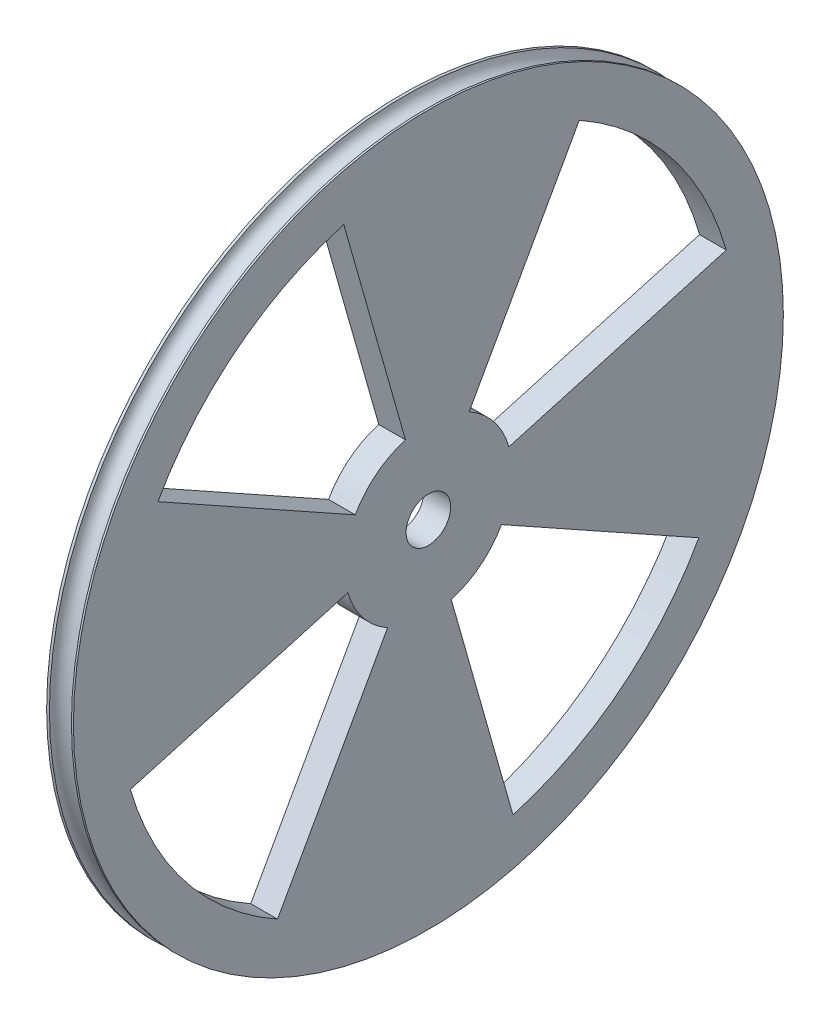
ISO-10303-21;
HEADER;
FILE_DESCRIPTION(('STEP AP214'),'2;1');
FILE_NAME('part.step','',(''),(''),'','','');
FILE_SCHEMA(('AUTOMOTIVE_DESIGN { 1 0 10303 214 1 1 1 1 }'));
ENDSEC;
DATA;
#1=APPLICATION_CONTEXT('core data for automotive mechanical design processes');
#2=APPLICATION_PROTOCOL_DEFINITION('international standard','automotive_design',2000,#1);
#3=PRODUCT_CONTEXT('',#1,'mechanical');
#4=PRODUCT('Part','Part','',(#3));
#5=PRODUCT_RELATED_PRODUCT_CATEGORY('part','',(#4));
#6=PRODUCT_DEFINITION_FORMATION('','',#4);
#7=PRODUCT_DEFINITION_CONTEXT('part definition',#1,'design');
#8=PRODUCT_DEFINITION('design','',#6,#7);
#9=PRODUCT_DEFINITION_SHAPE('','',#8);
#10=(LENGTH_UNIT() NAMED_UNIT(*) SI_UNIT(.MILLI.,.METRE.));
#11=(NAMED_UNIT(*) PLANE_ANGLE_UNIT() SI_UNIT($,.RADIAN.));
#12=(NAMED_UNIT(*) SI_UNIT($,.STERADIAN.) SOLID_ANGLE_UNIT());
#13=UNCERTAINTY_MEASURE_WITH_UNIT(LENGTH_MEASURE(1.E-05),#10,'distance_accuracy_value','');
#14=(GEOMETRIC_REPRESENTATION_CONTEXT(3) GLOBAL_UNCERTAINTY_ASSIGNED_CONTEXT((#13)) GLOBAL_UNIT_ASSIGNED_CONTEXT((#10,
#11,#12)) REPRESENTATION_CONTEXT('',''));
#15=CARTESIAN_POINT('',(0.,0.,0.));
#16=DIRECTION('',(0.,0.,1.));
#17=DIRECTION('',(1.,0.,0.));
#18=AXIS2_PLACEMENT_3D('',#15,#16,#17);
#19=CARTESIAN_POINT('',(0.,50.546,0.));
#20=DIRECTION('',(1.,0.,0.));
#21=DIRECTION('',(0.,0.,-1.));
#22=AXIS2_PLACEMENT_3D('',#19,#20,#21);
#23=PLANE('',#22);
#24=CARTESIAN_POINT('',(0.,0.,0.));
#25=DIRECTION('',(1.,0.,0.));
#26=DIRECTION('',(0.,0.,-1.));
#27=AXIS2_PLACEMENT_3D('',#24,#25,#26);
#28=CIRCLE('',#27,3.175);
#29=CARTESIAN_POINT('',(0.,0.,-3.175));
#30=VERTEX_POINT('',#29);
#31=EDGE_CURVE('E295',#30,#30,#28,.T.);
#32=ORIENTED_EDGE('',*,*,#31,.T.);
#33=EDGE_LOOP('',(#32));
#34=FACE_BOUND('',#33,.T.);
#35=CARTESIAN_POINT('',(0.,0.,0.));
#36=DIRECTION('',(1.,0.,0.));
#37=DIRECTION('',(0.,0.,-1.));
#38=AXIS2_PLACEMENT_3D('',#35,#36,#37);
#39=CIRCLE('',#38,11.9232198909498);
#40=CARTESIAN_POINT('',(0.,-3.2563701045731,11.4699270403078));
#41=VERTEX_POINT('',#40);
#42=CARTESIAN_POINT('',(0.,-10.4130645729134,5.80786180691978));
#43=VERTEX_POINT('',#42);
#44=EDGE_CURVE('E256',#41,#43,#39,.T.);
#45=ORIENTED_EDGE('',*,*,#44,.F.);
#46=DIRECTION('',(0.,-0.273111637154726,0.961982345810288));
#47=VECTOR('',#46,1.);
#48=CARTESIAN_POINT('',(0.,0.,0.));
#49=LINE('',#48,#47);
#50=CARTESIAN_POINT('',(0.,-12.0433290603831,42.4202720234474));
#51=VERTEX_POINT('',#50);
#52=EDGE_CURVE('E271',#41,#51,#49,.T.);
#53=ORIENTED_EDGE('',*,*,#52,.T.);
#54=CARTESIAN_POINT('',(0.,0.,0.));
#55=DIRECTION('',(1.,0.,0.));
#56=DIRECTION('',(0.,0.,-1.));
#57=AXIS2_PLACEMENT_3D('',#54,#55,#56);
#58=CIRCLE('',#57,44.0967261075007);
#59=CARTESIAN_POINT('',(0.,-38.5115816542155,21.4797423608996));
#60=VERTEX_POINT('',#59);
#61=EDGE_CURVE('E285',#51,#60,#58,.T.);
#62=ORIENTED_EDGE('',*,*,#61,.T.);
#63=DIRECTION('',(0.,-0.873343330757265,0.487105149451129));
#64=VECTOR('',#63,1.);
#65=CARTESIAN_POINT('',(0.,0.,0.));
#66=LINE('',#65,#64);
#67=EDGE_CURVE('E282',#43,#60,#66,.T.);
#68=ORIENTED_EDGE('',*,*,#67,.F.);
#69=EDGE_LOOP('',(#45,#53,#62,#68));
#70=FACE_BOUND('',#69,.T.);
#71=CARTESIAN_POINT('',(0.,0.,0.));
#72=DIRECTION('',(1.,0.,0.));
#73=DIRECTION('',(0.,0.,-1.));
#74=AXIS2_PLACEMENT_3D('',#71,#72,#73);
#75=CIRCLE('',#74,11.9232198909498);
#76=CARTESIAN_POINT('',(0.,-11.4699270403078,-3.25637010457314));
#77=VERTEX_POINT('',#76);
#78=CARTESIAN_POINT('',(0.,-5.80786180691974,-10.4130645729134));
#79=VERTEX_POINT('',#78);
#80=EDGE_CURVE('E216',#77,#79,#75,.T.);
#81=ORIENTED_EDGE('',*,*,#80,.F.);
#82=DIRECTION('',(0.,-0.961982345810287,-0.27311163715473));
#83=VECTOR('',#82,1.);
#84=CARTESIAN_POINT('',(0.,0.,0.));
#85=LINE('',#84,#83);
#86=CARTESIAN_POINT('',(0.,-42.4202720234473,-12.0433290603832));
#87=VERTEX_POINT('',#86);
#88=EDGE_CURVE('E231',#77,#87,#85,.T.);
#89=ORIENTED_EDGE('',*,*,#88,.T.);
#90=CARTESIAN_POINT('',(0.,0.,0.));
#91=DIRECTION('',(1.,0.,0.));
#92=DIRECTION('',(0.,0.,-1.));
#93=AXIS2_PLACEMENT_3D('',#90,#91,#92);
#94=CIRCLE('',#93,44.0967261075007);
#95=CARTESIAN_POINT('',(0.,-21.4797423608995,-38.5115816542156));
#96=VERTEX_POINT('',#95);
#97=EDGE_CURVE('E245',#87,#96,#94,.T.);
#98=ORIENTED_EDGE('',*,*,#97,.T.);
#99=DIRECTION('',(0.,-0.487105149451126,-0.873343330757267));
#100=VECTOR('',#99,1.);
#101=CARTESIAN_POINT('',(0.,0.,0.));
#102=LINE('',#101,#100);
#103=EDGE_CURVE('E242',#79,#96,#102,.T.);
#104=ORIENTED_EDGE('',*,*,#103,.F.);
#105=EDGE_LOOP('',(#81,#89,#98,#104));
#106=FACE_BOUND('',#105,.T.);
#107=CARTESIAN_POINT('',(0.,0.,0.));
#108=DIRECTION('',(1.,0.,0.));
#109=DIRECTION('',(0.,0.,-1.));
#110=AXIS2_PLACEMENT_3D('',#107,#108,#109);
#111=CIRCLE('',#110,11.9232198909498);
#112=CARTESIAN_POINT('',(0.,3.25637010457318,-11.4699270403078));
#113=VERTEX_POINT('',#112);
#114=CARTESIAN_POINT('',(0.,10.4130645729134,-5.80786180691971));
#115=VERTEX_POINT('',#114);
#116=EDGE_CURVE('E198',#113,#115,#111,.T.);
#117=ORIENTED_EDGE('',*,*,#116,.F.);
#118=DIRECTION('',(0.,0.273111637154733,-0.961982345810286));
#119=VECTOR('',#118,1.);
#120=CARTESIAN_POINT('',(0.,0.,0.));
#121=LINE('',#120,#119);
#122=CARTESIAN_POINT('',(0.,12.0433290603834,-42.4202720234473));
#123=VERTEX_POINT('',#122);
#124=EDGE_CURVE('E166',#113,#123,#121,.T.);
#125=ORIENTED_EDGE('',*,*,#124,.T.);
#126=CARTESIAN_POINT('',(0.,0.,0.));
#127=DIRECTION('',(1.,0.,0.));
#128=DIRECTION('',(0.,0.,-1.));
#129=AXIS2_PLACEMENT_3D('',#126,#127,#128);
#130=CIRCLE('',#129,44.0967261075007);
#131=CARTESIAN_POINT('',(0.,38.5115816542157,-21.4797423608994));
#132=VERTEX_POINT('',#131);
#133=EDGE_CURVE('E206',#123,#132,#130,.T.);
#134=ORIENTED_EDGE('',*,*,#133,.T.);
#135=DIRECTION('',(0.,0.873343330757268,-0.487105149451123));
#136=VECTOR('',#135,1.);
#137=CARTESIAN_POINT('',(0.,0.,0.));
#138=LINE('',#137,#136);
#139=EDGE_CURVE('E201',#115,#132,#138,.T.);
#140=ORIENTED_EDGE('',*,*,#139,.F.);
#141=EDGE_LOOP('',(#117,#125,#134,#140));
#142=FACE_BOUND('',#141,.T.);
#143=CARTESIAN_POINT('',(0.,0.,0.));
#144=DIRECTION('',(1.,0.,0.));
#145=DIRECTION('',(0.,0.,-1.));
#146=AXIS2_PLACEMENT_3D('',#143,#144,#145);
#147=CIRCLE('',#146,11.9232198909498);
#148=CARTESIAN_POINT('',(0.,11.4699270403078,3.25637010457322));
#149=VERTEX_POINT('',#148);
#150=CARTESIAN_POINT('',(0.,5.80786180691967,10.4130645729134));
#151=VERTEX_POINT('',#150);
#152=EDGE_CURVE('E312',#149,#151,#147,.T.);
#153=ORIENTED_EDGE('',*,*,#152,.F.);
#154=DIRECTION('',(0.,0.961982345810286,0.273111637154736));
#155=VECTOR('',#154,1.);
#156=CARTESIAN_POINT('',(0.,0.,0.));
#157=LINE('',#156,#155);
#158=CARTESIAN_POINT('',(0.,42.4202720234472,12.0433290603835));
#159=VERTEX_POINT('',#158);
#160=EDGE_CURVE('E299',#149,#159,#157,.T.);
#161=ORIENTED_EDGE('',*,*,#160,.T.);
#162=CARTESIAN_POINT('',(0.,0.,0.));
#163=DIRECTION('',(1.,0.,0.));
#164=DIRECTION('',(0.,0.,-1.));
#165=AXIS2_PLACEMENT_3D('',#162,#163,#164);
#166=CIRCLE('',#165,44.0967261075007);
#167=CARTESIAN_POINT('',(0.,21.4797423608993,38.5115816542158));
#168=VERTEX_POINT('',#167);
#169=EDGE_CURVE('E303',#159,#168,#166,.T.);
#170=ORIENTED_EDGE('',*,*,#169,.T.);
#171=DIRECTION('',(0.,0.48710514945112,0.87334333075727));
#172=VECTOR('',#171,1.);
#173=CARTESIAN_POINT('',(0.,0.,0.));
#174=LINE('',#173,#172);
#175=EDGE_CURVE('E308',#151,#168,#174,.T.);
#176=ORIENTED_EDGE('',*,*,#175,.F.);
#177=EDGE_LOOP('',(#153,#161,#170,#176));
#178=FACE_BOUND('',#177,.T.);
#179=CARTESIAN_POINT('',(0.,0.,0.));
#180=DIRECTION('',(-1.,0.,0.));
#181=DIRECTION('',(0.,0.,1.));
#182=AXIS2_PLACEMENT_3D('',#179,#180,#181);
#183=CIRCLE('',#182,50.546);
#184=CARTESIAN_POINT('',(0.,0.,50.546));
#185=VERTEX_POINT('',#184);
#186=EDGE_CURVE('E329',#185,#185,#183,.T.);
#187=ORIENTED_EDGE('',*,*,#186,.T.);
#188=EDGE_LOOP('',(#187));
#189=FACE_BOUND('',#188,.T.);
#190=ADVANCED_FACE('F45',(#34,#70,#106,#142,#178,#189),#23,.F.);
#191=CARTESIAN_POINT('',(3.81000000000001,0.,0.));
#192=DIRECTION('',(-1.,0.,0.));
#193=DIRECTION('',(0.,0.,1.));
#194=AXIS2_PLACEMENT_3D('',#191,#192,#193);
#195=PLANE('',#194);
#196=CARTESIAN_POINT('',(3.81000000000001,0.,0.));
#197=DIRECTION('',(1.,0.,0.));
#198=DIRECTION('',(0.,0.,-1.));
#199=AXIS2_PLACEMENT_3D('',#196,#197,#198);
#200=CIRCLE('',#199,3.175);
#201=CARTESIAN_POINT('',(3.81000000000001,0.,-3.175));
#202=VERTEX_POINT('',#201);
#203=EDGE_CURVE('E265',#202,#202,#200,.T.);
#204=ORIENTED_EDGE('',*,*,#203,.F.);
#205=EDGE_LOOP('',(#204));
#206=FACE_BOUND('',#205,.T.);
#207=CARTESIAN_POINT('',(3.81000000000001,0.,0.));
#208=DIRECTION('',(1.,0.,0.));
#209=DIRECTION('',(0.,0.,-1.));
#210=AXIS2_PLACEMENT_3D('',#207,#208,#209);
#211=CIRCLE('',#210,44.0967261075007);
#212=CARTESIAN_POINT('',(3.81000000000001,-12.0433290603831,42.4202720234474));
#213=VERTEX_POINT('',#212);
#214=CARTESIAN_POINT('',(3.81000000000001,-38.5115816542155,21.4797423608996));
#215=VERTEX_POINT('',#214);
#216=EDGE_CURVE('E275',#213,#215,#211,.T.);
#217=ORIENTED_EDGE('',*,*,#216,.F.);
#218=DIRECTION('',(0.,-0.273111637154726,0.961982345810288));
#219=VECTOR('',#218,1.);
#220=CARTESIAN_POINT('',(3.81000000000001,0.,0.));
#221=LINE('',#220,#219);
#222=CARTESIAN_POINT('',(3.81000000000001,-3.2563701045731,11.4699270403078));
#223=VERTEX_POINT('',#222);
#224=EDGE_CURVE('E225',#223,#213,#221,.T.);
#225=ORIENTED_EDGE('',*,*,#224,.F.);
#226=CARTESIAN_POINT('',(3.81000000000001,0.,0.));
#227=DIRECTION('',(1.,0.,0.));
#228=DIRECTION('',(0.,0.,-1.));
#229=AXIS2_PLACEMENT_3D('',#226,#227,#228);
#230=CIRCLE('',#229,11.9232198909498);
#231=CARTESIAN_POINT('',(3.81000000000001,-10.4130645729134,5.80786180691978));
#232=VERTEX_POINT('',#231);
#233=EDGE_CURVE('E266',#223,#232,#230,.T.);
#234=ORIENTED_EDGE('',*,*,#233,.T.);
#235=DIRECTION('',(0.,-0.873343330757265,0.487105149451129));
#236=VECTOR('',#235,1.);
#237=CARTESIAN_POINT('',(3.81000000000001,0.,0.));
#238=LINE('',#237,#236);
#239=EDGE_CURVE('E270',#232,#215,#238,.T.);
#240=ORIENTED_EDGE('',*,*,#239,.T.);
#241=EDGE_LOOP('',(#217,#225,#234,#240));
#242=FACE_BOUND('',#241,.T.);
#243=CARTESIAN_POINT('',(3.81000000000001,0.,0.));
#244=DIRECTION('',(1.,0.,0.));
#245=DIRECTION('',(0.,0.,-1.));
#246=AXIS2_PLACEMENT_3D('',#243,#244,#245);
#247=CIRCLE('',#246,44.0967261075007);
#248=CARTESIAN_POINT('',(3.81000000000001,-42.4202720234473,-12.0433290603832));
#249=VERTEX_POINT('',#248);
#250=CARTESIAN_POINT('',(3.81000000000001,-21.4797423608995,-38.5115816542156));
#251=VERTEX_POINT('',#250);
#252=EDGE_CURVE('E235',#249,#251,#247,.T.);
#253=ORIENTED_EDGE('',*,*,#252,.F.);
#254=DIRECTION('',(0.,-0.961982345810287,-0.27311163715473));
#255=VECTOR('',#254,1.);
#256=CARTESIAN_POINT('',(3.81000000000001,0.,0.));
#257=LINE('',#256,#255);
#258=CARTESIAN_POINT('',(3.81000000000001,-11.4699270403078,-3.25637010457314));
#259=VERTEX_POINT('',#258);
#260=EDGE_CURVE('E171',#259,#249,#257,.T.);
#261=ORIENTED_EDGE('',*,*,#260,.F.);
#262=CARTESIAN_POINT('',(3.81000000000001,0.,0.));
#263=DIRECTION('',(1.,0.,0.));
#264=DIRECTION('',(0.,0.,-1.));
#265=AXIS2_PLACEMENT_3D('',#262,#263,#264);
#266=CIRCLE('',#265,11.9232198909498);
#267=CARTESIAN_POINT('',(3.81000000000001,-5.80786180691974,-10.4130645729134));
#268=VERTEX_POINT('',#267);
#269=EDGE_CURVE('E226',#259,#268,#266,.T.);
#270=ORIENTED_EDGE('',*,*,#269,.T.);
#271=DIRECTION('',(0.,-0.487105149451126,-0.873343330757267));
#272=VECTOR('',#271,1.);
#273=CARTESIAN_POINT('',(3.81000000000001,0.,0.));
#274=LINE('',#273,#272);
#275=EDGE_CURVE('E230',#268,#251,#274,.T.);
#276=ORIENTED_EDGE('',*,*,#275,.T.);
#277=EDGE_LOOP('',(#253,#261,#270,#276));
#278=FACE_BOUND('',#277,.T.);
#279=CARTESIAN_POINT('',(3.81000000000001,0.,0.));
#280=DIRECTION('',(1.,0.,0.));
#281=DIRECTION('',(0.,0.,-1.));
#282=AXIS2_PLACEMENT_3D('',#279,#280,#281);
#283=CIRCLE('',#282,44.0967261075007);
#284=CARTESIAN_POINT('',(3.81000000000001,12.0433290603834,-42.4202720234473));
#285=VERTEX_POINT('',#284);
#286=CARTESIAN_POINT('',(3.81000000000001,38.5115816542157,-21.4797423608994));
#287=VERTEX_POINT('',#286);
#288=EDGE_CURVE('E187',#285,#287,#283,.T.);
#289=ORIENTED_EDGE('',*,*,#288,.F.);
#290=DIRECTION('',(0.,0.273111637154733,-0.961982345810286));
#291=VECTOR('',#290,1.);
#292=CARTESIAN_POINT('',(3.81000000000001,0.,0.));
#293=LINE('',#292,#291);
#294=CARTESIAN_POINT('',(3.81000000000001,3.25637010457318,-11.4699270403078));
#295=VERTEX_POINT('',#294);
#296=EDGE_CURVE('E163',#295,#285,#293,.T.);
#297=ORIENTED_EDGE('',*,*,#296,.F.);
#298=CARTESIAN_POINT('',(3.81000000000001,0.,0.));
#299=DIRECTION('',(1.,0.,0.));
#300=DIRECTION('',(0.,0.,-1.));
#301=AXIS2_PLACEMENT_3D('',#298,#299,#300);
#302=CIRCLE('',#301,11.9232198909498);
#303=CARTESIAN_POINT('',(3.81000000000001,10.4130645729134,-5.80786180691971));
#304=VERTEX_POINT('',#303);
#305=EDGE_CURVE('E174',#295,#304,#302,.T.);
#306=ORIENTED_EDGE('',*,*,#305,.T.);
#307=DIRECTION('',(0.,0.873343330757268,-0.487105149451123));
#308=VECTOR('',#307,1.);
#309=CARTESIAN_POINT('',(3.81000000000001,0.,0.));
#310=LINE('',#309,#308);
#311=EDGE_CURVE('E181',#304,#287,#310,.T.);
#312=ORIENTED_EDGE('',*,*,#311,.T.);
#313=EDGE_LOOP('',(#289,#297,#306,#312));
#314=FACE_BOUND('',#313,.T.);
#315=CARTESIAN_POINT('',(3.81000000000001,0.,0.));
#316=DIRECTION('',(1.,0.,0.));
#317=DIRECTION('',(0.,0.,-1.));
#318=AXIS2_PLACEMENT_3D('',#315,#316,#317);
#319=CIRCLE('',#318,44.0967261075007);
#320=CARTESIAN_POINT('',(3.81000000000001,42.4202720234472,12.0433290603835));
#321=VERTEX_POINT('',#320);
#322=CARTESIAN_POINT('',(3.81000000000001,21.4797423608993,38.5115816542158));
#323=VERTEX_POINT('',#322);
#324=EDGE_CURVE('E193',#321,#323,#319,.T.);
#325=ORIENTED_EDGE('',*,*,#324,.F.);
#326=DIRECTION('',(0.,0.961982345810286,0.273111637154736));
#327=VECTOR('',#326,1.);
#328=CARTESIAN_POINT('',(3.81000000000001,0.,0.));
#329=LINE('',#328,#327);
#330=CARTESIAN_POINT('',(3.81000000000001,11.4699270403078,3.25637010457322));
#331=VERTEX_POINT('',#330);
#332=EDGE_CURVE('E189',#331,#321,#329,.T.);
#333=ORIENTED_EDGE('',*,*,#332,.F.);
#334=CARTESIAN_POINT('',(3.81000000000001,0.,0.));
#335=DIRECTION('',(1.,0.,0.));
#336=DIRECTION('',(0.,0.,-1.));
#337=AXIS2_PLACEMENT_3D('',#334,#335,#336);
#338=CIRCLE('',#337,11.9232198909498);
#339=CARTESIAN_POINT('',(3.81000000000001,5.80786180691967,10.4130645729134));
#340=VERTEX_POINT('',#339);
#341=EDGE_CURVE('E304',#331,#340,#338,.T.);
#342=ORIENTED_EDGE('',*,*,#341,.T.);
#343=DIRECTION('',(0.,0.48710514945112,0.87334333075727));
#344=VECTOR('',#343,1.);
#345=CARTESIAN_POINT('',(3.81000000000001,0.,0.));
#346=LINE('',#345,#344);
#347=EDGE_CURVE('E319',#340,#323,#346,.T.);
#348=ORIENTED_EDGE('',*,*,#347,.T.);
#349=EDGE_LOOP('',(#325,#333,#342,#348));
#350=FACE_BOUND('',#349,.T.);
#351=CARTESIAN_POINT('',(3.81000000000001,0.,0.));
#352=DIRECTION('',(-1.,0.,0.));
#353=DIRECTION('',(0.,0.,1.));
#354=AXIS2_PLACEMENT_3D('',#351,#352,#353);
#355=CIRCLE('',#354,50.546);
#356=CARTESIAN_POINT('',(3.81000000000001,0.,50.546));
#357=VERTEX_POINT('',#356);
#358=EDGE_CURVE('E11',#357,#357,#355,.T.);
#359=ORIENTED_EDGE('',*,*,#358,.F.);
#360=EDGE_LOOP('',(#359));
#361=FACE_BOUND('',#360,.T.);
#362=ADVANCED_FACE('F184',(#206,#242,#278,#314,#350,#361),#195,.F.);
#363=CARTESIAN_POINT('',(0.,0.,0.));
#364=DIRECTION('',(-1.,0.,0.));
#365=DIRECTION('',(0.,0.,1.));
#366=AXIS2_PLACEMENT_3D('',#363,#364,#365);
#367=CYLINDRICAL_SURFACE('',#366,50.546);
#368=CARTESIAN_POINT('',(3.5303771370026,0.,0.));
#369=DIRECTION('',(-1.,0.,0.));
#370=DIRECTION('',(0.,0.,1.));
#371=AXIS2_PLACEMENT_3D('',#368,#369,#370);
#372=CIRCLE('',#371,50.546);
#373=CARTESIAN_POINT('',(3.5303771370026,0.,50.546));
#374=VERTEX_POINT('',#373);
#375=EDGE_CURVE('E53',#374,#374,#372,.T.);
#376=ORIENTED_EDGE('',*,*,#375,.F.);
#377=EDGE_LOOP('',(#376));
#378=FACE_BOUND('',#377,.T.);
#379=ORIENTED_EDGE('',*,*,#358,.T.);
#380=EDGE_LOOP('',(#379));
#381=FACE_BOUND('',#380,.T.);
#382=ADVANCED_FACE('F351',(#378,#381),#367,.T.);
#383=CARTESIAN_POINT('',(1.96332887673746,0.,0.));
#384=DIRECTION('',(-1.,0.,0.));
#385=DIRECTION('',(0.,0.,1.));
#386=AXIS2_PLACEMENT_3D('',#383,#384,#385);
#387=TOROIDAL_SURFACE('',#386,50.8,1.5875);
#388=CARTESIAN_POINT('',(0.396280616472321,0.,0.));
#389=DIRECTION('',(-1.,0.,0.));
#390=DIRECTION('',(0.,0.,1.));
#391=AXIS2_PLACEMENT_3D('',#388,#389,#390);
#392=CIRCLE('',#391,50.546);
#393=CARTESIAN_POINT('',(0.396280616472321,0.,50.546));
#394=VERTEX_POINT('',#393);
#395=EDGE_CURVE('E342',#394,#394,#392,.T.);
#396=ORIENTED_EDGE('',*,*,#395,.F.);
#397=EDGE_LOOP('',(#396));
#398=FACE_BOUND('',#397,.T.);
#399=ORIENTED_EDGE('',*,*,#375,.T.);
#400=EDGE_LOOP('',(#399));
#401=FACE_BOUND('',#400,.T.);
#402=ADVANCED_FACE('F349',(#398,#401),#387,.F.);
#403=CARTESIAN_POINT('',(0.,0.,0.));
#404=DIRECTION('',(-1.,0.,0.));
#405=DIRECTION('',(0.,0.,1.));
#406=AXIS2_PLACEMENT_3D('',#403,#404,#405);
#407=CYLINDRICAL_SURFACE('',#406,50.546);
#408=ORIENTED_EDGE('',*,*,#186,.F.);
#409=EDGE_LOOP('',(#408));
#410=FACE_BOUND('',#409,.T.);
#411=ORIENTED_EDGE('',*,*,#395,.T.);
#412=EDGE_LOOP('',(#411));
#413=FACE_BOUND('',#412,.T.);
#414=ADVANCED_FACE('F369',(#410,#413),#407,.T.);
#415=CARTESIAN_POINT('',(0.,0.,0.));
#416=DIRECTION('',(0.,0.273111637154736,-0.961982345810285));
#417=DIRECTION('',(0.,0.961982345810286,0.273111637154736));
#418=AXIS2_PLACEMENT_3D('',#415,#416,#417);
#419=PLANE('',#418);
#420=ORIENTED_EDGE('',*,*,#332,.T.);
#421=DIRECTION('',(1.,0.,0.));
#422=VECTOR('',#421,1.);
#423=CARTESIAN_POINT('',(0.,42.4202720234472,12.0433290603835));
#424=LINE('',#423,#422);
#425=EDGE_CURVE('E314',#159,#321,#424,.T.);
#426=ORIENTED_EDGE('',*,*,#425,.F.);
#427=ORIENTED_EDGE('',*,*,#160,.F.);
#428=DIRECTION('',(1.,0.,0.));
#429=VECTOR('',#428,1.);
#430=CARTESIAN_POINT('',(0.,11.4699270403078,3.25637010457322));
#431=LINE('',#430,#429);
#432=EDGE_CURVE('E326',#149,#331,#431,.T.);
#433=ORIENTED_EDGE('',*,*,#432,.T.);
#434=EDGE_LOOP('',(#420,#426,#427,#433));
#435=FACE_BOUND('',#434,.T.);
#436=ADVANCED_FACE('F373',(#435),#419,.F.);
#437=CARTESIAN_POINT('',(0.,0.,0.));
#438=DIRECTION('',(1.,0.,0.));
#439=DIRECTION('',(0.,0.,-1.));
#440=AXIS2_PLACEMENT_3D('',#437,#438,#439);
#441=CYLINDRICAL_SURFACE('',#440,11.9232198909498);
#442=ORIENTED_EDGE('',*,*,#341,.F.);
#443=ORIENTED_EDGE('',*,*,#432,.F.);
#444=ORIENTED_EDGE('',*,*,#152,.T.);
#445=DIRECTION('',(1.,0.,0.));
#446=VECTOR('',#445,1.);
#447=CARTESIAN_POINT('',(0.,5.80786180691967,10.4130645729134));
#448=LINE('',#447,#446);
#449=EDGE_CURVE('E330',#151,#340,#448,.T.);
#450=ORIENTED_EDGE('',*,*,#449,.T.);
#451=EDGE_LOOP('',(#442,#443,#444,#450));
#452=FACE_BOUND('',#451,.T.);
#453=ADVANCED_FACE('F376',(#452),#441,.T.);
#454=CARTESIAN_POINT('',(0.,0.,0.));
#455=DIRECTION('',(0.,0.87334333075727,-0.48710514945112));
#456=DIRECTION('',(0.,0.48710514945112,0.87334333075727));
#457=AXIS2_PLACEMENT_3D('',#454,#455,#456);
#458=PLANE('',#457);
#459=ORIENTED_EDGE('',*,*,#347,.F.);
#460=ORIENTED_EDGE('',*,*,#449,.F.);
#461=ORIENTED_EDGE('',*,*,#175,.T.);
#462=DIRECTION('',(1.,0.,0.));
#463=VECTOR('',#462,1.);
#464=CARTESIAN_POINT('',(0.,21.4797423608993,38.5115816542158));
#465=LINE('',#464,#463);
#466=EDGE_CURVE('E333',#168,#323,#465,.T.);
#467=ORIENTED_EDGE('',*,*,#466,.T.);
#468=EDGE_LOOP('',(#459,#460,#461,#467));
#469=FACE_BOUND('',#468,.T.);
#470=ADVANCED_FACE('F381',(#469),#458,.T.);
#471=CARTESIAN_POINT('',(0.,0.,0.));
#472=DIRECTION('',(1.,0.,0.));
#473=DIRECTION('',(0.,0.,-1.));
#474=AXIS2_PLACEMENT_3D('',#471,#472,#473);
#475=CYLINDRICAL_SURFACE('',#474,44.0967261075007);
#476=ORIENTED_EDGE('',*,*,#324,.T.);
#477=ORIENTED_EDGE('',*,*,#466,.F.);
#478=ORIENTED_EDGE('',*,*,#169,.F.);
#479=ORIENTED_EDGE('',*,*,#425,.T.);
#480=EDGE_LOOP('',(#476,#477,#478,#479));
#481=FACE_BOUND('',#480,.T.);
#482=ADVANCED_FACE('F378',(#481),#475,.F.);
#483=CARTESIAN_POINT('',(0.,0.,0.));
#484=DIRECTION('',(0.,-0.961982345810286,-0.273111637154733));
#485=DIRECTION('',(0.,0.273111637154733,-0.961982345810287));
#486=AXIS2_PLACEMENT_3D('',#483,#484,#485);
#487=PLANE('',#486);
#488=ORIENTED_EDGE('',*,*,#296,.T.);
#489=DIRECTION('',(1.,0.,0.));
#490=VECTOR('',#489,1.);
#491=CARTESIAN_POINT('',(0.,12.0433290603834,-42.4202720234473));
#492=LINE('',#491,#490);
#493=EDGE_CURVE('E202',#123,#285,#492,.T.);
#494=ORIENTED_EDGE('',*,*,#493,.F.);
#495=ORIENTED_EDGE('',*,*,#124,.F.);
#496=DIRECTION('',(1.,0.,0.));
#497=VECTOR('',#496,1.);
#498=CARTESIAN_POINT('',(0.,3.25637010457318,-11.4699270403078));
#499=LINE('',#498,#497);
#500=EDGE_CURVE('E159',#113,#295,#499,.T.);
#501=ORIENTED_EDGE('',*,*,#500,.T.);
#502=EDGE_LOOP('',(#488,#494,#495,#501));
#503=FACE_BOUND('',#502,.T.);
#504=ADVANCED_FACE('F161',(#503),#487,.F.);
#505=CARTESIAN_POINT('',(0.,0.,0.));
#506=DIRECTION('',(1.,0.,0.));
#507=DIRECTION('',(0.,0.,-1.));
#508=AXIS2_PLACEMENT_3D('',#505,#506,#507);
#509=CYLINDRICAL_SURFACE('',#508,11.9232198909498);
#510=ORIENTED_EDGE('',*,*,#305,.F.);
#511=ORIENTED_EDGE('',*,*,#500,.F.);
#512=ORIENTED_EDGE('',*,*,#116,.T.);
#513=DIRECTION('',(1.,0.,0.));
#514=VECTOR('',#513,1.);
#515=CARTESIAN_POINT('',(0.,10.4130645729134,-5.80786180691971));
#516=LINE('',#515,#514);
#517=EDGE_CURVE('E170',#115,#304,#516,.T.);
#518=ORIENTED_EDGE('',*,*,#517,.T.);
#519=EDGE_LOOP('',(#510,#511,#512,#518));
#520=FACE_BOUND('',#519,.T.);
#521=ADVANCED_FACE('F175',(#520),#509,.T.);
#522=CARTESIAN_POINT('',(0.,0.,0.));
#523=DIRECTION('',(0.,-0.487105149451123,-0.873343330757268));
#524=DIRECTION('',(0.,0.873343330757268,-0.487105149451123));
#525=AXIS2_PLACEMENT_3D('',#522,#523,#524);
#526=PLANE('',#525);
#527=ORIENTED_EDGE('',*,*,#311,.F.);
#528=ORIENTED_EDGE('',*,*,#517,.F.);
#529=ORIENTED_EDGE('',*,*,#139,.T.);
#530=DIRECTION('',(1.,0.,0.));
#531=VECTOR('',#530,1.);
#532=CARTESIAN_POINT('',(0.,38.5115816542157,-21.4797423608994));
#533=LINE('',#532,#531);
#534=EDGE_CURVE('E565',#132,#287,#533,.T.);
#535=ORIENTED_EDGE('',*,*,#534,.T.);
#536=EDGE_LOOP('',(#527,#528,#529,#535));
#537=FACE_BOUND('',#536,.T.);
#538=ADVANCED_FACE('F426',(#537),#526,.T.);
#539=CARTESIAN_POINT('',(0.,0.,0.));
#540=DIRECTION('',(1.,0.,0.));
#541=DIRECTION('',(0.,0.,-1.));
#542=AXIS2_PLACEMENT_3D('',#539,#540,#541);
#543=CYLINDRICAL_SURFACE('',#542,44.0967261075007);
#544=ORIENTED_EDGE('',*,*,#288,.T.);
#545=ORIENTED_EDGE('',*,*,#534,.F.);
#546=ORIENTED_EDGE('',*,*,#133,.F.);
#547=ORIENTED_EDGE('',*,*,#493,.T.);
#548=EDGE_LOOP('',(#544,#545,#546,#547));
#549=FACE_BOUND('',#548,.T.);
#550=ADVANCED_FACE('F422',(#549),#543,.F.);
#551=CARTESIAN_POINT('',(0.,0.,0.));
#552=DIRECTION('',(0.,-0.27311163715473,0.961982345810287));
#553=DIRECTION('',(0.,-0.961982345810287,-0.27311163715473));
#554=AXIS2_PLACEMENT_3D('',#551,#552,#553);
#555=PLANE('',#554);
#556=ORIENTED_EDGE('',*,*,#260,.T.);
#557=DIRECTION('',(1.,0.,0.));
#558=VECTOR('',#557,1.);
#559=CARTESIAN_POINT('',(0.,-42.4202720234473,-12.0433290603832));
#560=LINE('',#559,#558);
#561=EDGE_CURVE('E212',#87,#249,#560,.T.);
#562=ORIENTED_EDGE('',*,*,#561,.F.);
#563=ORIENTED_EDGE('',*,*,#88,.F.);
#564=DIRECTION('',(1.,0.,0.));
#565=VECTOR('',#564,1.);
#566=CARTESIAN_POINT('',(0.,-11.4699270403078,-3.25637010457314));
#567=LINE('',#566,#565);
#568=EDGE_CURVE('E222',#77,#259,#567,.T.);
#569=ORIENTED_EDGE('',*,*,#568,.T.);
#570=EDGE_LOOP('',(#556,#562,#563,#569));
#571=FACE_BOUND('',#570,.T.);
#572=ADVANCED_FACE('F413',(#571),#555,.F.);
#573=CARTESIAN_POINT('',(0.,0.,0.));
#574=DIRECTION('',(1.,0.,0.));
#575=DIRECTION('',(0.,0.,-1.));
#576=AXIS2_PLACEMENT_3D('',#573,#574,#575);
#577=CYLINDRICAL_SURFACE('',#576,11.9232198909498);
#578=ORIENTED_EDGE('',*,*,#269,.F.);
#579=ORIENTED_EDGE('',*,*,#568,.F.);
#580=ORIENTED_EDGE('',*,*,#80,.T.);
#581=DIRECTION('',(1.,0.,0.));
#582=VECTOR('',#581,1.);
#583=CARTESIAN_POINT('',(0.,-5.80786180691974,-10.4130645729134));
#584=LINE('',#583,#582);
#585=EDGE_CURVE('E219',#79,#268,#584,.T.);
#586=ORIENTED_EDGE('',*,*,#585,.T.);
#587=EDGE_LOOP('',(#578,#579,#580,#586));
#588=FACE_BOUND('',#587,.T.);
#589=ADVANCED_FACE('F409',(#588),#577,.T.);
#590=CARTESIAN_POINT('',(0.,0.,0.));
#591=DIRECTION('',(0.,-0.873343330757266,0.487105149451126));
#592=DIRECTION('',(0.,-0.487105149451126,-0.873343330757267));
#593=AXIS2_PLACEMENT_3D('',#590,#591,#592);
#594=PLANE('',#593);
#595=ORIENTED_EDGE('',*,*,#275,.F.);
#596=ORIENTED_EDGE('',*,*,#585,.F.);
#597=ORIENTED_EDGE('',*,*,#103,.T.);
#598=DIRECTION('',(1.,0.,0.));
#599=VECTOR('',#598,1.);
#600=CARTESIAN_POINT('',(0.,-21.4797423608995,-38.5115816542156));
#601=LINE('',#600,#599);
#602=EDGE_CURVE('E68',#96,#251,#601,.T.);
#603=ORIENTED_EDGE('',*,*,#602,.T.);
#604=EDGE_LOOP('',(#595,#596,#597,#603));
#605=FACE_BOUND('',#604,.T.);
#606=ADVANCED_FACE('F412',(#605),#594,.T.);
#607=CARTESIAN_POINT('',(0.,0.,0.));
#608=DIRECTION('',(1.,0.,0.));
#609=DIRECTION('',(0.,0.,-1.));
#610=AXIS2_PLACEMENT_3D('',#607,#608,#609);
#611=CYLINDRICAL_SURFACE('',#610,44.0967261075007);
#612=ORIENTED_EDGE('',*,*,#252,.T.);
#613=ORIENTED_EDGE('',*,*,#602,.F.);
#614=ORIENTED_EDGE('',*,*,#97,.F.);
#615=ORIENTED_EDGE('',*,*,#561,.T.);
#616=EDGE_LOOP('',(#612,#613,#614,#615));
#617=FACE_BOUND('',#616,.T.);
#618=ADVANCED_FACE('F407',(#617),#611,.F.);
#619=CARTESIAN_POINT('',(0.,0.,0.));
#620=DIRECTION('',(0.,0.961982345810288,0.273111637154726));
#621=DIRECTION('',(0.,-0.273111637154726,0.961982345810288));
#622=AXIS2_PLACEMENT_3D('',#619,#620,#621);
#623=PLANE('',#622);
#624=ORIENTED_EDGE('',*,*,#224,.T.);
#625=DIRECTION('',(1.,0.,0.));
#626=VECTOR('',#625,1.);
#627=CARTESIAN_POINT('',(0.,-12.0433290603831,42.4202720234474));
#628=LINE('',#627,#626);
#629=EDGE_CURVE('E252',#51,#213,#628,.T.);
#630=ORIENTED_EDGE('',*,*,#629,.F.);
#631=ORIENTED_EDGE('',*,*,#52,.F.);
#632=DIRECTION('',(1.,0.,0.));
#633=VECTOR('',#632,1.);
#634=CARTESIAN_POINT('',(0.,-3.2563701045731,11.4699270403078));
#635=LINE('',#634,#633);
#636=EDGE_CURVE('E262',#41,#223,#635,.T.);
#637=ORIENTED_EDGE('',*,*,#636,.T.);
#638=EDGE_LOOP('',(#624,#630,#631,#637));
#639=FACE_BOUND('',#638,.T.);
#640=ADVANCED_FACE('F398',(#639),#623,.F.);
#641=CARTESIAN_POINT('',(0.,0.,0.));
#642=DIRECTION('',(1.,0.,0.));
#643=DIRECTION('',(0.,0.,-1.));
#644=AXIS2_PLACEMENT_3D('',#641,#642,#643);
#645=CYLINDRICAL_SURFACE('',#644,11.9232198909498);
#646=ORIENTED_EDGE('',*,*,#233,.F.);
#647=ORIENTED_EDGE('',*,*,#636,.F.);
#648=ORIENTED_EDGE('',*,*,#44,.T.);
#649=DIRECTION('',(1.,0.,0.));
#650=VECTOR('',#649,1.);
#651=CARTESIAN_POINT('',(0.,-10.4130645729134,5.80786180691978));
#652=LINE('',#651,#650);
#653=EDGE_CURVE('E259',#43,#232,#652,.T.);
#654=ORIENTED_EDGE('',*,*,#653,.T.);
#655=EDGE_LOOP('',(#646,#647,#648,#654));
#656=FACE_BOUND('',#655,.T.);
#657=ADVANCED_FACE('F394',(#656),#645,.T.);
#658=CARTESIAN_POINT('',(0.,0.,0.));
#659=DIRECTION('',(0.,0.487105149451129,0.873343330757265));
#660=DIRECTION('',(0.,-0.873343330757265,0.487105149451129));
#661=AXIS2_PLACEMENT_3D('',#658,#659,#660);
#662=PLANE('',#661);
#663=ORIENTED_EDGE('',*,*,#239,.F.);
#664=ORIENTED_EDGE('',*,*,#653,.F.);
#665=ORIENTED_EDGE('',*,*,#67,.T.);
#666=DIRECTION('',(1.,0.,0.));
#667=VECTOR('',#666,1.);
#668=CARTESIAN_POINT('',(0.,-38.5115816542155,21.4797423608996));
#669=LINE('',#668,#667);
#670=EDGE_CURVE('E60',#60,#215,#669,.T.);
#671=ORIENTED_EDGE('',*,*,#670,.T.);
#672=EDGE_LOOP('',(#663,#664,#665,#671));
#673=FACE_BOUND('',#672,.T.);
#674=ADVANCED_FACE('F397',(#673),#662,.T.);
#675=CARTESIAN_POINT('',(0.,0.,0.));
#676=DIRECTION('',(1.,0.,0.));
#677=DIRECTION('',(0.,0.,-1.));
#678=AXIS2_PLACEMENT_3D('',#675,#676,#677);
#679=CYLINDRICAL_SURFACE('',#678,44.0967261075007);
#680=ORIENTED_EDGE('',*,*,#216,.T.);
#681=ORIENTED_EDGE('',*,*,#670,.F.);
#682=ORIENTED_EDGE('',*,*,#61,.F.);
#683=ORIENTED_EDGE('',*,*,#629,.T.);
#684=EDGE_LOOP('',(#680,#681,#682,#683));
#685=FACE_BOUND('',#684,.T.);
#686=ADVANCED_FACE('F392',(#685),#679,.F.);
#687=CARTESIAN_POINT('',(0.,0.,0.));
#688=DIRECTION('',(1.,0.,0.));
#689=DIRECTION('',(0.,0.,-1.));
#690=AXIS2_PLACEMENT_3D('',#687,#688,#689);
#691=CYLINDRICAL_SURFACE('',#690,3.175);
#692=CARTESIAN_POINT('',(0.,0.,-3.175));
#693=CARTESIAN_POINT('',(0.0396875000000001,0.,-3.175));
#694=CARTESIAN_POINT('',(0.0793750000000001,0.,-3.175));
#695=CARTESIAN_POINT('',(0.15875,0.,-3.175));
#696=CARTESIAN_POINT('',(0.1984375,0.,-3.175));
#697=CARTESIAN_POINT('',(0.2778125,0.,-3.175));
#698=CARTESIAN_POINT('',(0.3175,0.,-3.175));
#699=CARTESIAN_POINT('',(0.396875000000001,0.,-3.175));
#700=CARTESIAN_POINT('',(0.436562500000001,0.,-3.175));
#701=CARTESIAN_POINT('',(0.515937500000001,0.,-3.175));
#702=CARTESIAN_POINT('',(0.555625000000001,0.,-3.175));
#703=CARTESIAN_POINT('',(0.635000000000001,0.,-3.175));
#704=CARTESIAN_POINT('',(0.674687500000001,0.,-3.175));
#705=CARTESIAN_POINT('',(0.754062500000001,0.,-3.175));
#706=CARTESIAN_POINT('',(0.793750000000001,0.,-3.175));
#707=CARTESIAN_POINT('',(0.873125000000001,0.,-3.175));
#708=CARTESIAN_POINT('',(0.912812500000001,0.,-3.175));
#709=CARTESIAN_POINT('',(0.992187500000002,0.,-3.175));
#710=CARTESIAN_POINT('',(1.031875,0.,-3.175));
#711=CARTESIAN_POINT('',(1.11125,0.,-3.175));
#712=CARTESIAN_POINT('',(1.1509375,0.,-3.175));
#713=CARTESIAN_POINT('',(1.2303125,0.,-3.175));
#714=CARTESIAN_POINT('',(1.27,0.,-3.175));
#715=CARTESIAN_POINT('',(1.349375,0.,-3.175));
#716=CARTESIAN_POINT('',(1.3890625,0.,-3.175));
#717=CARTESIAN_POINT('',(1.4684375,0.,-3.175));
#718=CARTESIAN_POINT('',(1.508125,0.,-3.175));
#719=CARTESIAN_POINT('',(1.5875,0.,-3.175));
#720=CARTESIAN_POINT('',(1.6271875,0.,-3.175));
#721=CARTESIAN_POINT('',(1.7065625,0.,-3.175));
#722=CARTESIAN_POINT('',(1.74625,0.,-3.175));
#723=CARTESIAN_POINT('',(1.825625,0.,-3.175));
#724=CARTESIAN_POINT('',(1.8653125,0.,-3.175));
#725=CARTESIAN_POINT('',(1.9446875,0.,-3.175));
#726=CARTESIAN_POINT('',(1.984375,0.,-3.175));
#727=CARTESIAN_POINT('',(2.06375,0.,-3.175));
#728=CARTESIAN_POINT('',(2.1034375,0.,-3.175));
#729=CARTESIAN_POINT('',(2.1828125,0.,-3.175));
#730=CARTESIAN_POINT('',(2.2225,0.,-3.175));
#731=CARTESIAN_POINT('',(2.301875,0.,-3.175));
#732=CARTESIAN_POINT('',(2.3415625,0.,-3.175));
#733=CARTESIAN_POINT('',(2.4209375,0.,-3.175));
#734=CARTESIAN_POINT('',(2.460625,0.,-3.175));
#735=CARTESIAN_POINT('',(2.54,0.,-3.175));
#736=CARTESIAN_POINT('',(2.5796875,0.,-3.175));
#737=CARTESIAN_POINT('',(2.6590625,0.,-3.175));
#738=CARTESIAN_POINT('',(2.69875,0.,-3.175));
#739=CARTESIAN_POINT('',(2.778125,0.,-3.175));
#740=CARTESIAN_POINT('',(2.8178125,0.,-3.175));
#741=CARTESIAN_POINT('',(2.8971875,0.,-3.175));
#742=CARTESIAN_POINT('',(2.936875,0.,-3.175));
#743=CARTESIAN_POINT('',(3.01625,0.,-3.175));
#744=CARTESIAN_POINT('',(3.0559375,0.,-3.175));
#745=CARTESIAN_POINT('',(3.1353125,0.,-3.175));
#746=CARTESIAN_POINT('',(3.175,0.,-3.175));
#747=CARTESIAN_POINT('',(3.254375,0.,-3.175));
#748=CARTESIAN_POINT('',(3.2940625,0.,-3.175));
#749=CARTESIAN_POINT('',(3.3734375,0.,-3.175));
#750=CARTESIAN_POINT('',(3.413125,0.,-3.175));
#751=CARTESIAN_POINT('',(3.49250000000001,0.,-3.175));
#752=CARTESIAN_POINT('',(3.5321875,0.,-3.175));
#753=CARTESIAN_POINT('',(3.61156250000001,0.,-3.175));
#754=CARTESIAN_POINT('',(3.65125,0.,-3.175));
#755=CARTESIAN_POINT('',(3.73062500000001,0.,-3.175));
#756=CARTESIAN_POINT('',(3.77031250000001,0.,-3.175));
#757=CARTESIAN_POINT('',(3.81000000000001,0.,-3.175));
#758=B_SPLINE_CURVE_WITH_KNOTS('',3,(#692,#693,#694,#695,#696,#697,#698,#699,#700,#701,#702,
#703,#704,#705,#706,#707,#708,#709,#710,#711,#712,#713,#714,#715,#716,#717,#718,#719,#720,#721,
#722,#723,#724,#725,#726,#727,#728,#729,#730,#731,#732,#733,#734,#735,#736,#737,#738,#739,#740,
#741,#742,#743,#744,#745,#746,#747,#748,#749,#750,#751,#752,#753,#754,#755,#756,#757),
.UNSPECIFIED.,.F.,.F.,(4,2,2,2,2,2,2,2,2,2,2,2,2,2,2,2,2,2,2,2,2,2,2,2,2,2,2,2,2,2,2,2,4),(0.,
0.1190625,0.238125,0.3571875,0.476250000000001,0.595312500000001,0.714375000000001,
0.833437500000001,0.952500000000001,1.0715625,1.190625,1.3096875,1.42875,1.5478125,1.666875,
1.7859375,1.905,2.0240625,2.143125,2.2621875,2.38125,2.5003125,2.619375,2.7384375,2.8575,
2.9765625,3.095625,3.21468750000001,3.33375,3.4528125,3.57187500000001,3.69093750000001,
3.81000000000001),.UNSPECIFIED.);
#759=EDGE_CURVE('BSEAM389',#30,#202,#758,.T.);
#760=ORIENTED_EDGE('',*,*,#31,.F.);
#761=ORIENTED_EDGE('',*,*,#203,.T.);
#762=ORIENTED_EDGE('',*,*,#759,.T.);
#763=ORIENTED_EDGE('',*,*,#759,.F.);
#764=EDGE_LOOP('',(#760,#762,#761,#763));
#765=FACE_BOUND('',#764,.T.);
#766=ADVANCED_FACE('F389',(#765),#691,.F.);
#767=CLOSED_SHELL('',(#190,#362,#382,#402,#414,#436,#453,#470,#482,#504,#521,#538,#550,#572,
#589,#606,#618,#640,#657,#674,#686,#766));
#768=MANIFOLD_SOLID_BREP('B2',#767);
#769=ADVANCED_BREP_SHAPE_REPRESENTATION('',(#18,#768),#14);
#770=SHAPE_DEFINITION_REPRESENTATION(#9,#769);
ENDSEC;
END-ISO-10303-21;
